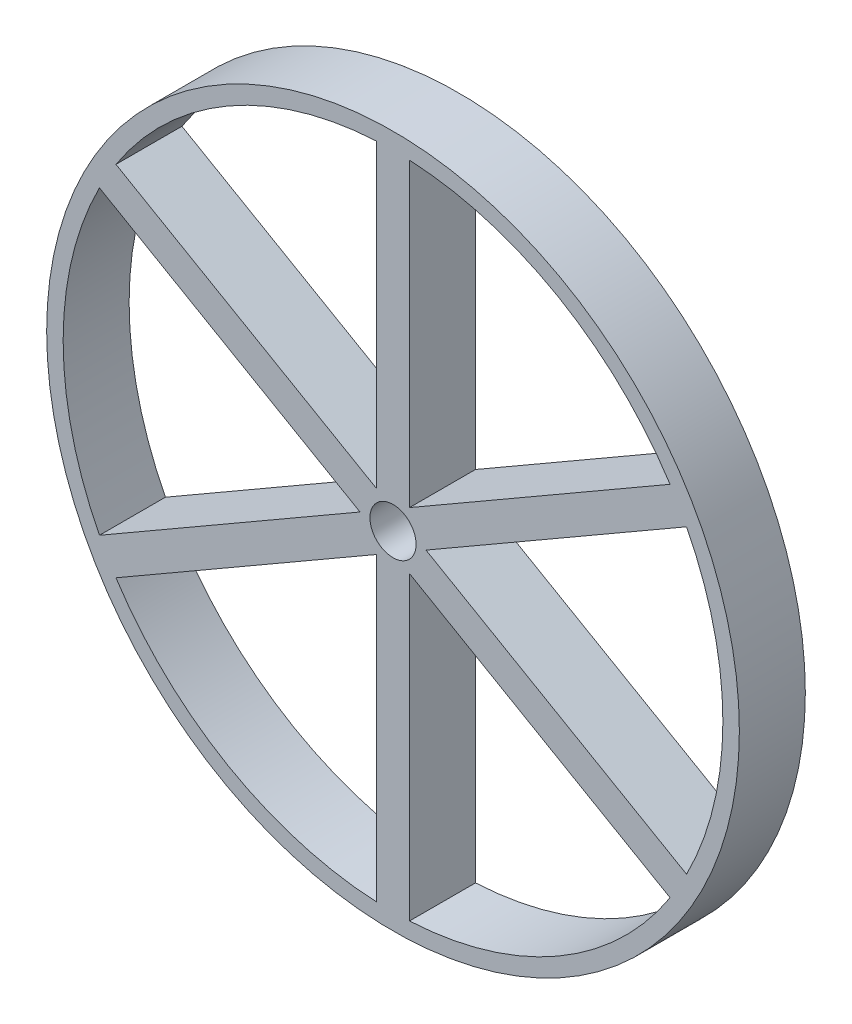
ISO-10303-21;
HEADER;
FILE_DESCRIPTION(('STEP AP214'),'2;1');
FILE_NAME('part.step','',(''),(''),'','','');
FILE_SCHEMA(('AUTOMOTIVE_DESIGN { 1 0 10303 214 1 1 1 1 }'));
ENDSEC;
DATA;
#1=APPLICATION_CONTEXT('core data for automotive mechanical design processes');
#2=APPLICATION_PROTOCOL_DEFINITION('international standard','automotive_design',2000,#1);
#3=PRODUCT_CONTEXT('',#1,'mechanical');
#4=PRODUCT('Part','Part','',(#3));
#5=PRODUCT_RELATED_PRODUCT_CATEGORY('part','',(#4));
#6=PRODUCT_DEFINITION_FORMATION('','',#4);
#7=PRODUCT_DEFINITION_CONTEXT('part definition',#1,'design');
#8=PRODUCT_DEFINITION('design','',#6,#7);
#9=PRODUCT_DEFINITION_SHAPE('','',#8);
#10=(LENGTH_UNIT() NAMED_UNIT(*) SI_UNIT(.MILLI.,.METRE.));
#11=(NAMED_UNIT(*) PLANE_ANGLE_UNIT() SI_UNIT($,.RADIAN.));
#12=(NAMED_UNIT(*) SI_UNIT($,.STERADIAN.) SOLID_ANGLE_UNIT());
#13=UNCERTAINTY_MEASURE_WITH_UNIT(LENGTH_MEASURE(1.E-05),#10,'distance_accuracy_value','');
#14=(GEOMETRIC_REPRESENTATION_CONTEXT(3) GLOBAL_UNCERTAINTY_ASSIGNED_CONTEXT((#13)) GLOBAL_UNIT_ASSIGNED_CONTEXT((#10,
#11,#12)) REPRESENTATION_CONTEXT('',''));
#15=CARTESIAN_POINT('',(0.,0.,0.));
#16=DIRECTION('',(0.,0.,1.));
#17=DIRECTION('',(1.,0.,0.));
#18=AXIS2_PLACEMENT_3D('',#15,#16,#17);
#19=CARTESIAN_POINT('',(2.5,0.,10.));
#20=DIRECTION('',(1.,0.,0.));
#21=DIRECTION('',(0.,1.,0.));
#22=AXIS2_PLACEMENT_3D('',#19,#20,#21);
#23=PLANE('',#22);
#24=DIRECTION('',(0.,-1.,0.));
#25=VECTOR('',#24,1.);
#26=CARTESIAN_POINT('',(2.5,0.,0.));
#27=LINE('',#26,#25);
#28=CARTESIAN_POINT('',(2.5,-4.33012701892219,0.));
#29=VERTEX_POINT('',#28);
#30=CARTESIAN_POINT('',(2.5,-49.9374608885955,0.));
#31=VERTEX_POINT('',#30);
#32=EDGE_CURVE('E171',#29,#31,#27,.T.);
#33=ORIENTED_EDGE('',*,*,#32,.F.);
#34=DIRECTION('',(0.,0.,-1.));
#35=VECTOR('',#34,1.);
#36=CARTESIAN_POINT('',(2.5,-4.33012701892219,10.));
#37=LINE('',#36,#35);
#38=CARTESIAN_POINT('',(2.5,-4.33012701892219,10.));
#39=VERTEX_POINT('',#38);
#40=EDGE_CURVE('E11',#39,#29,#37,.T.);
#41=ORIENTED_EDGE('',*,*,#40,.F.);
#42=DIRECTION('',(0.,-1.,0.));
#43=VECTOR('',#42,1.);
#44=CARTESIAN_POINT('',(2.5,0.,10.));
#45=LINE('',#44,#43);
#46=CARTESIAN_POINT('',(2.5,-49.9374608885955,10.));
#47=VERTEX_POINT('',#46);
#48=EDGE_CURVE('E169',#39,#47,#45,.T.);
#49=ORIENTED_EDGE('',*,*,#48,.T.);
#50=DIRECTION('',(0.,0.,-1.));
#51=VECTOR('',#50,1.);
#52=CARTESIAN_POINT('',(2.5,-49.9374608885955,10.));
#53=LINE('',#52,#51);
#54=EDGE_CURVE('E57',#47,#31,#53,.T.);
#55=ORIENTED_EDGE('',*,*,#54,.T.);
#56=EDGE_LOOP('',(#33,#41,#49,#55));
#57=FACE_BOUND('',#56,.T.);
#58=ADVANCED_FACE('F38',(#57),#23,.T.);
#59=CARTESIAN_POINT('',(-1.25,-2.1650635094611,10.));
#60=DIRECTION('',(0.5,0.866025403784439,0.));
#61=DIRECTION('',(-0.866025403784439,0.5,0.));
#62=AXIS2_PLACEMENT_3D('',#59,#60,#61);
#63=PLANE('',#62);
#64=DIRECTION('',(0.866025403784439,-0.5,0.));
#65=VECTOR('',#64,1.);
#66=CARTESIAN_POINT('',(-1.25,-2.1650635094611,0.));
#67=LINE('',#66,#65);
#68=CARTESIAN_POINT('',(41.9971097300155,-27.1337939537588,0.));
#69=VERTEX_POINT('',#68);
#70=EDGE_CURVE('E234',#29,#69,#67,.T.);
#71=ORIENTED_EDGE('',*,*,#70,.T.);
#72=DIRECTION('',(0.,0.,-1.));
#73=VECTOR('',#72,1.);
#74=CARTESIAN_POINT('',(41.9971097300155,-27.1337939537588,10.));
#75=LINE('',#74,#73);
#76=CARTESIAN_POINT('',(41.9971097300155,-27.1337939537588,10.));
#77=VERTEX_POINT('',#76);
#78=EDGE_CURVE('E48',#77,#69,#75,.T.);
#79=ORIENTED_EDGE('',*,*,#78,.F.);
#80=DIRECTION('',(0.866025403784439,-0.5,0.));
#81=VECTOR('',#80,1.);
#82=CARTESIAN_POINT('',(-1.25,-2.1650635094611,10.));
#83=LINE('',#82,#81);
#84=EDGE_CURVE('E174',#39,#77,#83,.T.);
#85=ORIENTED_EDGE('',*,*,#84,.F.);
#86=ORIENTED_EDGE('',*,*,#40,.T.);
#87=EDGE_LOOP('',(#71,#79,#85,#86));
#88=FACE_BOUND('',#87,.T.);
#89=ADVANCED_FACE('F175',(#88),#63,.F.);
#90=CARTESIAN_POINT('',(1.25,-2.1650635094611,10.));
#91=DIRECTION('',(0.5,-0.866025403784438,0.));
#92=DIRECTION('',(0.866025403784438,0.5,0.));
#93=AXIS2_PLACEMENT_3D('',#90,#91,#92);
#94=PLANE('',#93);
#95=DIRECTION('',(-0.866025403784438,-0.5,0.));
#96=VECTOR('',#95,1.);
#97=CARTESIAN_POINT('',(1.25,-2.1650635094611,0.));
#98=LINE('',#97,#96);
#99=CARTESIAN_POINT('',(-2.5,-4.33012701892219,0.));
#100=VERTEX_POINT('',#99);
#101=CARTESIAN_POINT('',(-41.9971097300155,-27.1337939537588,0.));
#102=VERTEX_POINT('',#101);
#103=EDGE_CURVE('E226',#100,#102,#98,.T.);
#104=ORIENTED_EDGE('',*,*,#103,.F.);
#105=DIRECTION('',(0.,0.,-1.));
#106=VECTOR('',#105,1.);
#107=CARTESIAN_POINT('',(-2.5,-4.33012701892219,10.));
#108=LINE('',#107,#106);
#109=CARTESIAN_POINT('',(-2.5,-4.33012701892219,10.));
#110=VERTEX_POINT('',#109);
#111=EDGE_CURVE('E241',#110,#100,#108,.T.);
#112=ORIENTED_EDGE('',*,*,#111,.F.);
#113=DIRECTION('',(-0.866025403784438,-0.5,0.));
#114=VECTOR('',#113,1.);
#115=CARTESIAN_POINT('',(1.25,-2.1650635094611,10.));
#116=LINE('',#115,#114);
#117=CARTESIAN_POINT('',(-41.9971097300155,-27.1337939537588,10.));
#118=VERTEX_POINT('',#117);
#119=EDGE_CURVE('E307',#110,#118,#116,.T.);
#120=ORIENTED_EDGE('',*,*,#119,.T.);
#121=DIRECTION('',(0.,0.,-1.));
#122=VECTOR('',#121,1.);
#123=CARTESIAN_POINT('',(-41.9971097300155,-27.1337939537588,10.));
#124=LINE('',#123,#122);
#125=EDGE_CURVE('E243',#118,#102,#124,.T.);
#126=ORIENTED_EDGE('',*,*,#125,.T.);
#127=EDGE_LOOP('',(#104,#112,#120,#126));
#128=FACE_BOUND('',#127,.T.);
#129=ADVANCED_FACE('F352',(#128),#94,.T.);
#130=CARTESIAN_POINT('',(-2.5,0.,10.));
#131=DIRECTION('',(1.,0.,0.));
#132=DIRECTION('',(0.,1.,0.));
#133=AXIS2_PLACEMENT_3D('',#130,#131,#132);
#134=PLANE('',#133);
#135=DIRECTION('',(0.,-1.,0.));
#136=VECTOR('',#135,1.);
#137=CARTESIAN_POINT('',(-2.5,0.,0.));
#138=LINE('',#137,#136);
#139=CARTESIAN_POINT('',(-2.5,-49.9374608885955,0.));
#140=VERTEX_POINT('',#139);
#141=EDGE_CURVE('E229',#100,#140,#138,.T.);
#142=ORIENTED_EDGE('',*,*,#141,.T.);
#143=DIRECTION('',(0.,0.,-1.));
#144=VECTOR('',#143,1.);
#145=CARTESIAN_POINT('',(-2.5,-49.9374608885955,10.));
#146=LINE('',#145,#144);
#147=CARTESIAN_POINT('',(-2.5,-49.9374608885955,10.));
#148=VERTEX_POINT('',#147);
#149=EDGE_CURVE('E245',#148,#140,#146,.T.);
#150=ORIENTED_EDGE('',*,*,#149,.F.);
#151=DIRECTION('',(0.,-1.,0.));
#152=VECTOR('',#151,1.);
#153=CARTESIAN_POINT('',(-2.5,0.,10.));
#154=LINE('',#153,#152);
#155=EDGE_CURVE('E184',#110,#148,#154,.T.);
#156=ORIENTED_EDGE('',*,*,#155,.F.);
#157=ORIENTED_EDGE('',*,*,#111,.T.);
#158=EDGE_LOOP('',(#142,#150,#156,#157));
#159=FACE_BOUND('',#158,.T.);
#160=ADVANCED_FACE('F354',(#159),#134,.F.);
#161=CARTESIAN_POINT('',(-1.25,-2.1650635094611,10.));
#162=DIRECTION('',(-0.499999999999999,-0.866025403784439,0.));
#163=DIRECTION('',(0.866025403784439,-0.499999999999999,0.));
#164=AXIS2_PLACEMENT_3D('',#161,#162,#163);
#165=PLANE('',#164);
#166=DIRECTION('',(-0.866025403784439,0.499999999999999,0.));
#167=VECTOR('',#166,1.);
#168=CARTESIAN_POINT('',(-1.25,-2.1650635094611,0.));
#169=LINE('',#168,#167);
#170=CARTESIAN_POINT('',(-5.,0.,0.));
#171=VERTEX_POINT('',#170);
#172=CARTESIAN_POINT('',(-44.4971097300155,22.8036669348366,0.));
#173=VERTEX_POINT('',#172);
#174=EDGE_CURVE('E219',#171,#173,#169,.T.);
#175=ORIENTED_EDGE('',*,*,#174,.F.);
#176=DIRECTION('',(0.,0.,-1.));
#177=VECTOR('',#176,1.);
#178=CARTESIAN_POINT('',(-5.,0.,10.));
#179=LINE('',#178,#177);
#180=CARTESIAN_POINT('',(-5.,0.,10.));
#181=VERTEX_POINT('',#180);
#182=EDGE_CURVE('E246',#181,#171,#179,.T.);
#183=ORIENTED_EDGE('',*,*,#182,.F.);
#184=DIRECTION('',(-0.866025403784439,0.499999999999999,0.));
#185=VECTOR('',#184,1.);
#186=CARTESIAN_POINT('',(-1.25,-2.1650635094611,10.));
#187=LINE('',#186,#185);
#188=CARTESIAN_POINT('',(-44.4971097300155,22.8036669348366,10.));
#189=VERTEX_POINT('',#188);
#190=EDGE_CURVE('E299',#181,#189,#187,.T.);
#191=ORIENTED_EDGE('',*,*,#190,.T.);
#192=DIRECTION('',(0.,0.,-1.));
#193=VECTOR('',#192,1.);
#194=CARTESIAN_POINT('',(-44.4971097300155,22.8036669348366,10.));
#195=LINE('',#194,#193);
#196=EDGE_CURVE('E249',#189,#173,#195,.T.);
#197=ORIENTED_EDGE('',*,*,#196,.T.);
#198=EDGE_LOOP('',(#175,#183,#191,#197));
#199=FACE_BOUND('',#198,.T.);
#200=ADVANCED_FACE('F357',(#199),#165,.T.);
#201=CARTESIAN_POINT('',(-1.25,2.1650635094611,10.));
#202=DIRECTION('',(0.5,-0.866025403784438,0.));
#203=DIRECTION('',(0.866025403784438,0.5,0.));
#204=AXIS2_PLACEMENT_3D('',#201,#202,#203);
#205=PLANE('',#204);
#206=DIRECTION('',(-0.866025403784439,-0.5,0.));
#207=VECTOR('',#206,1.);
#208=CARTESIAN_POINT('',(-1.25,2.1650635094611,0.));
#209=LINE('',#208,#207);
#210=CARTESIAN_POINT('',(-44.4971097300155,-22.8036669348366,0.));
#211=VERTEX_POINT('',#210);
#212=EDGE_CURVE('E222',#171,#211,#209,.T.);
#213=ORIENTED_EDGE('',*,*,#212,.T.);
#214=DIRECTION('',(0.,0.,-1.));
#215=VECTOR('',#214,1.);
#216=CARTESIAN_POINT('',(-44.4971097300155,-22.8036669348366,10.));
#217=LINE('',#216,#215);
#218=CARTESIAN_POINT('',(-44.4971097300155,-22.8036669348366,10.));
#219=VERTEX_POINT('',#218);
#220=EDGE_CURVE('E251',#219,#211,#217,.T.);
#221=ORIENTED_EDGE('',*,*,#220,.F.);
#222=DIRECTION('',(-0.866025403784439,-0.5,0.));
#223=VECTOR('',#222,1.);
#224=CARTESIAN_POINT('',(-1.25,2.1650635094611,10.));
#225=LINE('',#224,#223);
#226=EDGE_CURVE('E303',#181,#219,#225,.T.);
#227=ORIENTED_EDGE('',*,*,#226,.F.);
#228=ORIENTED_EDGE('',*,*,#182,.T.);
#229=EDGE_LOOP('',(#213,#221,#227,#228));
#230=FACE_BOUND('',#229,.T.);
#231=ADVANCED_FACE('F318',(#230),#205,.F.);
#232=CARTESIAN_POINT('',(-2.5,0.,10.));
#233=DIRECTION('',(-1.,0.,0.));
#234=DIRECTION('',(0.,0.,1.));
#235=AXIS2_PLACEMENT_3D('',#232,#233,#234);
#236=PLANE('',#235);
#237=DIRECTION('',(0.,1.,0.));
#238=VECTOR('',#237,1.);
#239=CARTESIAN_POINT('',(-2.5,0.,0.));
#240=LINE('',#239,#238);
#241=CARTESIAN_POINT('',(-2.5,4.33012701892219,0.));
#242=VERTEX_POINT('',#241);
#243=CARTESIAN_POINT('',(-2.5,49.9374608885955,0.));
#244=VERTEX_POINT('',#243);
#245=EDGE_CURVE('E212',#242,#244,#240,.T.);
#246=ORIENTED_EDGE('',*,*,#245,.F.);
#247=DIRECTION('',(0.,0.,-1.));
#248=VECTOR('',#247,1.);
#249=CARTESIAN_POINT('',(-2.5,4.33012701892219,10.));
#250=LINE('',#249,#248);
#251=CARTESIAN_POINT('',(-2.5,4.33012701892219,10.));
#252=VERTEX_POINT('',#251);
#253=EDGE_CURVE('E252',#252,#242,#250,.T.);
#254=ORIENTED_EDGE('',*,*,#253,.F.);
#255=DIRECTION('',(0.,1.,0.));
#256=VECTOR('',#255,1.);
#257=CARTESIAN_POINT('',(-2.5,0.,10.));
#258=LINE('',#257,#256);
#259=CARTESIAN_POINT('',(-2.5,49.9374608885955,10.));
#260=VERTEX_POINT('',#259);
#261=EDGE_CURVE('E290',#252,#260,#258,.T.);
#262=ORIENTED_EDGE('',*,*,#261,.T.);
#263=DIRECTION('',(0.,0.,-1.));
#264=VECTOR('',#263,1.);
#265=CARTESIAN_POINT('',(-2.5,49.9374608885955,10.));
#266=LINE('',#265,#264);
#267=EDGE_CURVE('E255',#260,#244,#266,.T.);
#268=ORIENTED_EDGE('',*,*,#267,.T.);
#269=EDGE_LOOP('',(#246,#254,#262,#268));
#270=FACE_BOUND('',#269,.T.);
#271=ADVANCED_FACE('F364',(#270),#236,.T.);
#272=CARTESIAN_POINT('',(1.25,2.1650635094611,10.));
#273=DIRECTION('',(-0.499999999999999,-0.866025403784439,0.));
#274=DIRECTION('',(0.866025403784439,-0.499999999999999,0.));
#275=AXIS2_PLACEMENT_3D('',#272,#273,#274);
#276=PLANE('',#275);
#277=DIRECTION('',(-0.866025403784439,0.499999999999999,0.));
#278=VECTOR('',#277,1.);
#279=CARTESIAN_POINT('',(1.25,2.1650635094611,0.));
#280=LINE('',#279,#278);
#281=CARTESIAN_POINT('',(-41.9971097300155,27.1337939537588,0.));
#282=VERTEX_POINT('',#281);
#283=EDGE_CURVE('E215',#242,#282,#280,.T.);
#284=ORIENTED_EDGE('',*,*,#283,.T.);
#285=DIRECTION('',(0.,0.,-1.));
#286=VECTOR('',#285,1.);
#287=CARTESIAN_POINT('',(-41.9971097300155,27.1337939537588,10.));
#288=LINE('',#287,#286);
#289=CARTESIAN_POINT('',(-41.9971097300155,27.1337939537588,10.));
#290=VERTEX_POINT('',#289);
#291=EDGE_CURVE('E257',#290,#282,#288,.T.);
#292=ORIENTED_EDGE('',*,*,#291,.F.);
#293=DIRECTION('',(-0.866025403784439,0.499999999999999,0.));
#294=VECTOR('',#293,1.);
#295=CARTESIAN_POINT('',(1.25,2.1650635094611,10.));
#296=LINE('',#295,#294);
#297=EDGE_CURVE('E295',#252,#290,#296,.T.);
#298=ORIENTED_EDGE('',*,*,#297,.F.);
#299=ORIENTED_EDGE('',*,*,#253,.T.);
#300=EDGE_LOOP('',(#284,#292,#298,#299));
#301=FACE_BOUND('',#300,.T.);
#302=ADVANCED_FACE('F368',(#301),#276,.F.);
#303=CARTESIAN_POINT('',(-1.25,2.16506350946109,10.));
#304=DIRECTION('',(-0.5,0.866025403784438,0.));
#305=DIRECTION('',(-0.866025403784439,-0.5,0.));
#306=AXIS2_PLACEMENT_3D('',#303,#304,#305);
#307=PLANE('',#306);
#308=DIRECTION('',(0.866025403784439,0.5,0.));
#309=VECTOR('',#308,1.);
#310=CARTESIAN_POINT('',(-1.25,2.16506350946109,0.));
#311=LINE('',#310,#309);
#312=CARTESIAN_POINT('',(2.5,4.33012701892219,0.));
#313=VERTEX_POINT('',#312);
#314=CARTESIAN_POINT('',(41.9971097300155,27.1337939537588,0.));
#315=VERTEX_POINT('',#314);
#316=EDGE_CURVE('E204',#313,#315,#311,.T.);
#317=ORIENTED_EDGE('',*,*,#316,.F.);
#318=DIRECTION('',(0.,0.,-1.));
#319=VECTOR('',#318,1.);
#320=CARTESIAN_POINT('',(2.5,4.33012701892219,10.));
#321=LINE('',#320,#319);
#322=CARTESIAN_POINT('',(2.5,4.33012701892219,10.));
#323=VERTEX_POINT('',#322);
#324=EDGE_CURVE('E258',#323,#313,#321,.T.);
#325=ORIENTED_EDGE('',*,*,#324,.F.);
#326=DIRECTION('',(0.866025403784439,0.5,0.));
#327=VECTOR('',#326,1.);
#328=CARTESIAN_POINT('',(-1.25,2.16506350946109,10.));
#329=LINE('',#328,#327);
#330=CARTESIAN_POINT('',(41.9971097300155,27.1337939537588,10.));
#331=VERTEX_POINT('',#330);
#332=EDGE_CURVE('E283',#323,#331,#329,.T.);
#333=ORIENTED_EDGE('',*,*,#332,.T.);
#334=DIRECTION('',(0.,0.,-1.));
#335=VECTOR('',#334,1.);
#336=CARTESIAN_POINT('',(41.9971097300155,27.1337939537588,10.));
#337=LINE('',#336,#335);
#338=EDGE_CURVE('E261',#331,#315,#337,.T.);
#339=ORIENTED_EDGE('',*,*,#338,.T.);
#340=EDGE_LOOP('',(#317,#325,#333,#339));
#341=FACE_BOUND('',#340,.T.);
#342=ADVANCED_FACE('F371',(#341),#307,.T.);
#343=CARTESIAN_POINT('',(2.5,0.,10.));
#344=DIRECTION('',(-1.,0.,0.));
#345=DIRECTION('',(0.,0.,1.));
#346=AXIS2_PLACEMENT_3D('',#343,#344,#345);
#347=PLANE('',#346);
#348=DIRECTION('',(0.,1.,0.));
#349=VECTOR('',#348,1.);
#350=CARTESIAN_POINT('',(2.5,0.,0.));
#351=LINE('',#350,#349);
#352=CARTESIAN_POINT('',(2.5,49.9374608885955,0.));
#353=VERTEX_POINT('',#352);
#354=EDGE_CURVE('E209',#313,#353,#351,.T.);
#355=ORIENTED_EDGE('',*,*,#354,.T.);
#356=DIRECTION('',(0.,0.,-1.));
#357=VECTOR('',#356,1.);
#358=CARTESIAN_POINT('',(2.5,49.9374608885955,10.));
#359=LINE('',#358,#357);
#360=CARTESIAN_POINT('',(2.5,49.9374608885955,10.));
#361=VERTEX_POINT('',#360);
#362=EDGE_CURVE('E263',#361,#353,#359,.T.);
#363=ORIENTED_EDGE('',*,*,#362,.F.);
#364=DIRECTION('',(0.,1.,0.));
#365=VECTOR('',#364,1.);
#366=CARTESIAN_POINT('',(2.5,0.,10.));
#367=LINE('',#366,#365);
#368=EDGE_CURVE('E286',#323,#361,#367,.T.);
#369=ORIENTED_EDGE('',*,*,#368,.F.);
#370=ORIENTED_EDGE('',*,*,#324,.T.);
#371=EDGE_LOOP('',(#355,#363,#369,#370));
#372=FACE_BOUND('',#371,.T.);
#373=ADVANCED_FACE('F376',(#372),#347,.F.);
#374=CARTESIAN_POINT('',(1.25,2.1650635094611,10.));
#375=DIRECTION('',(0.5,0.866025403784439,0.));
#376=DIRECTION('',(-0.866025403784439,0.5,0.));
#377=AXIS2_PLACEMENT_3D('',#374,#375,#376);
#378=PLANE('',#377);
#379=DIRECTION('',(0.866025403784439,-0.5,0.));
#380=VECTOR('',#379,1.);
#381=CARTESIAN_POINT('',(1.25,2.1650635094611,0.));
#382=LINE('',#381,#380);
#383=CARTESIAN_POINT('',(5.,0.,0.));
#384=VERTEX_POINT('',#383);
#385=CARTESIAN_POINT('',(44.4971097300155,-22.8036669348366,0.));
#386=VERTEX_POINT('',#385);
#387=EDGE_CURVE('E194',#384,#386,#382,.T.);
#388=ORIENTED_EDGE('',*,*,#387,.F.);
#389=DIRECTION('',(0.,0.,-1.));
#390=VECTOR('',#389,1.);
#391=CARTESIAN_POINT('',(5.,0.,10.));
#392=LINE('',#391,#390);
#393=CARTESIAN_POINT('',(5.,0.,10.));
#394=VERTEX_POINT('',#393);
#395=EDGE_CURVE('E42',#394,#384,#392,.T.);
#396=ORIENTED_EDGE('',*,*,#395,.F.);
#397=DIRECTION('',(0.866025403784439,-0.5,0.));
#398=VECTOR('',#397,1.);
#399=CARTESIAN_POINT('',(1.25,2.1650635094611,10.));
#400=LINE('',#399,#398);
#401=CARTESIAN_POINT('',(44.4971097300155,-22.8036669348366,10.));
#402=VERTEX_POINT('',#401);
#403=EDGE_CURVE('E239',#394,#402,#400,.T.);
#404=ORIENTED_EDGE('',*,*,#403,.T.);
#405=DIRECTION('',(0.,0.,-1.));
#406=VECTOR('',#405,1.);
#407=CARTESIAN_POINT('',(44.4971097300155,-22.8036669348366,10.));
#408=LINE('',#407,#406);
#409=EDGE_CURVE('E193',#402,#386,#408,.T.);
#410=ORIENTED_EDGE('',*,*,#409,.T.);
#411=EDGE_LOOP('',(#388,#396,#404,#410));
#412=FACE_BOUND('',#411,.T.);
#413=ADVANCED_FACE('F40',(#412),#378,.T.);
#414=CARTESIAN_POINT('',(1.25,-2.1650635094611,10.));
#415=DIRECTION('',(-0.5,0.866025403784438,0.));
#416=DIRECTION('',(-0.866025403784439,-0.5,0.));
#417=AXIS2_PLACEMENT_3D('',#414,#415,#416);
#418=PLANE('',#417);
#419=DIRECTION('',(0.866025403784439,0.5,0.));
#420=VECTOR('',#419,1.);
#421=CARTESIAN_POINT('',(1.25,-2.1650635094611,0.));
#422=LINE('',#421,#420);
#423=CARTESIAN_POINT('',(44.4971097300155,22.8036669348366,0.));
#424=VERTEX_POINT('',#423);
#425=EDGE_CURVE('E197',#384,#424,#422,.T.);
#426=ORIENTED_EDGE('',*,*,#425,.T.);
#427=DIRECTION('',(0.,0.,-1.));
#428=VECTOR('',#427,1.);
#429=CARTESIAN_POINT('',(44.4971097300155,22.8036669348366,10.));
#430=LINE('',#429,#428);
#431=CARTESIAN_POINT('',(44.4971097300155,22.8036669348366,10.));
#432=VERTEX_POINT('',#431);
#433=EDGE_CURVE('E266',#432,#424,#430,.T.);
#434=ORIENTED_EDGE('',*,*,#433,.F.);
#435=DIRECTION('',(0.866025403784439,0.5,0.));
#436=VECTOR('',#435,1.);
#437=CARTESIAN_POINT('',(1.25,-2.1650635094611,10.));
#438=LINE('',#437,#436);
#439=EDGE_CURVE('E274',#394,#432,#438,.T.);
#440=ORIENTED_EDGE('',*,*,#439,.F.);
#441=ORIENTED_EDGE('',*,*,#395,.T.);
#442=EDGE_LOOP('',(#426,#434,#440,#441));
#443=FACE_BOUND('',#442,.T.);
#444=ADVANCED_FACE('F273',(#443),#418,.F.);
#445=CARTESIAN_POINT('',(0.,0.,10.));
#446=DIRECTION('',(0.,0.,-1.));
#447=DIRECTION('',(-1.,0.,0.));
#448=AXIS2_PLACEMENT_3D('',#445,#446,#447);
#449=CYLINDRICAL_SURFACE('',#448,52.5);
#450=CARTESIAN_POINT('',(0.,0.,10.));
#451=DIRECTION('',(0.,0.,1.));
#452=DIRECTION('',(1.,0.,0.));
#453=AXIS2_PLACEMENT_3D('',#450,#451,#452);
#454=CIRCLE('',#453,52.5);
#455=CARTESIAN_POINT('',(52.5,0.,10.));
#456=VERTEX_POINT('',#455);
#457=EDGE_CURVE('E190',#456,#456,#454,.T.);
#458=ORIENTED_EDGE('',*,*,#457,.F.);
#459=EDGE_LOOP('',(#458));
#460=FACE_BOUND('',#459,.T.);
#461=CARTESIAN_POINT('',(0.,0.,0.));
#462=DIRECTION('',(0.,0.,1.));
#463=DIRECTION('',(1.,0.,0.));
#464=AXIS2_PLACEMENT_3D('',#461,#462,#463);
#465=CIRCLE('',#464,52.5);
#466=CARTESIAN_POINT('',(52.5,0.,0.));
#467=VERTEX_POINT('',#466);
#468=EDGE_CURVE('E236',#467,#467,#465,.T.);
#469=ORIENTED_EDGE('',*,*,#468,.T.);
#470=EDGE_LOOP('',(#469));
#471=FACE_BOUND('',#470,.T.);
#472=ADVANCED_FACE('F335',(#460,#471),#449,.T.);
#473=CARTESIAN_POINT('',(0.,0.,10.));
#474=DIRECTION('',(0.,0.,-1.));
#475=DIRECTION('',(-1.,0.,0.));
#476=AXIS2_PLACEMENT_3D('',#473,#474,#475);
#477=CYLINDRICAL_SURFACE('',#476,50.);
#478=CARTESIAN_POINT('',(0.,0.,0.));
#479=DIRECTION('',(0.,0.,1.));
#480=DIRECTION('',(1.,0.,0.));
#481=AXIS2_PLACEMENT_3D('',#478,#479,#480);
#482=CIRCLE('',#481,50.);
#483=EDGE_CURVE('E205',#31,#69,#482,.T.);
#484=ORIENTED_EDGE('',*,*,#483,.F.);
#485=ORIENTED_EDGE('',*,*,#54,.F.);
#486=CARTESIAN_POINT('',(0.,0.,10.));
#487=DIRECTION('',(0.,0.,1.));
#488=DIRECTION('',(1.,0.,0.));
#489=AXIS2_PLACEMENT_3D('',#486,#487,#488);
#490=CIRCLE('',#489,50.);
#491=EDGE_CURVE('E177',#47,#77,#490,.T.);
#492=ORIENTED_EDGE('',*,*,#491,.T.);
#493=ORIENTED_EDGE('',*,*,#78,.T.);
#494=EDGE_LOOP('',(#484,#485,#492,#493));
#495=FACE_BOUND('',#494,.T.);
#496=ADVANCED_FACE('F332',(#495),#477,.F.);
#497=EDGE_CURVE('E232',#102,#140,#482,.T.);
#498=ORIENTED_EDGE('',*,*,#497,.F.);
#499=ORIENTED_EDGE('',*,*,#125,.F.);
#500=EDGE_CURVE('E181',#118,#148,#490,.T.);
#501=ORIENTED_EDGE('',*,*,#500,.T.);
#502=ORIENTED_EDGE('',*,*,#149,.T.);
#503=EDGE_LOOP('',(#498,#499,#501,#502));
#504=FACE_BOUND('',#503,.T.);
#505=ADVANCED_FACE('F334',(#504),#477,.F.);
#506=EDGE_CURVE('E225',#173,#211,#482,.T.);
#507=ORIENTED_EDGE('',*,*,#506,.F.);
#508=ORIENTED_EDGE('',*,*,#196,.F.);
#509=EDGE_CURVE('E186',#189,#219,#490,.T.);
#510=ORIENTED_EDGE('',*,*,#509,.T.);
#511=ORIENTED_EDGE('',*,*,#220,.T.);
#512=EDGE_LOOP('',(#507,#508,#510,#511));
#513=FACE_BOUND('',#512,.T.);
#514=ADVANCED_FACE('F322',(#513),#477,.F.);
#515=EDGE_CURVE('E218',#244,#282,#482,.T.);
#516=ORIENTED_EDGE('',*,*,#515,.F.);
#517=ORIENTED_EDGE('',*,*,#267,.F.);
#518=EDGE_CURVE('E291',#260,#290,#490,.T.);
#519=ORIENTED_EDGE('',*,*,#518,.T.);
#520=ORIENTED_EDGE('',*,*,#291,.T.);
#521=EDGE_LOOP('',(#516,#517,#519,#520));
#522=FACE_BOUND('',#521,.T.);
#523=ADVANCED_FACE('F474',(#522),#477,.F.);
#524=EDGE_CURVE('E206',#315,#353,#482,.T.);
#525=ORIENTED_EDGE('',*,*,#524,.F.);
#526=ORIENTED_EDGE('',*,*,#338,.F.);
#527=EDGE_CURVE('E284',#331,#361,#490,.T.);
#528=ORIENTED_EDGE('',*,*,#527,.T.);
#529=ORIENTED_EDGE('',*,*,#362,.T.);
#530=EDGE_LOOP('',(#525,#526,#528,#529));
#531=FACE_BOUND('',#530,.T.);
#532=ADVANCED_FACE('F346',(#531),#477,.F.);
#533=EDGE_CURVE('E201',#386,#424,#482,.T.);
#534=ORIENTED_EDGE('',*,*,#533,.F.);
#535=ORIENTED_EDGE('',*,*,#409,.F.);
#536=EDGE_CURVE('E281',#402,#432,#490,.T.);
#537=ORIENTED_EDGE('',*,*,#536,.T.);
#538=ORIENTED_EDGE('',*,*,#433,.T.);
#539=EDGE_LOOP('',(#534,#535,#537,#538));
#540=FACE_BOUND('',#539,.T.);
#541=ADVANCED_FACE('F280',(#540),#477,.F.);
#542=CARTESIAN_POINT('',(0.,0.,10.));
#543=DIRECTION('',(0.,0.,1.));
#544=DIRECTION('',(1.,0.,0.));
#545=AXIS2_PLACEMENT_3D('',#542,#543,#544);
#546=PLANE('',#545);
#547=CARTESIAN_POINT('',(0.,0.,10.));
#548=DIRECTION('',(0.,0.,1.));
#549=DIRECTION('',(1.,0.,0.));
#550=AXIS2_PLACEMENT_3D('',#547,#548,#549);
#551=CIRCLE('',#550,3.5);
#552=CARTESIAN_POINT('',(3.5,0.,10.));
#553=VERTEX_POINT('',#552);
#554=EDGE_CURVE('E198',#553,#553,#551,.T.);
#555=ORIENTED_EDGE('',*,*,#554,.F.);
#556=EDGE_LOOP('',(#555));
#557=FACE_BOUND('',#556,.T.);
#558=ORIENTED_EDGE('',*,*,#403,.F.);
#559=ORIENTED_EDGE('',*,*,#439,.T.);
#560=ORIENTED_EDGE('',*,*,#536,.F.);
#561=EDGE_LOOP('',(#558,#559,#560));
#562=FACE_BOUND('',#561,.T.);
#563=ORIENTED_EDGE('',*,*,#332,.F.);
#564=ORIENTED_EDGE('',*,*,#368,.T.);
#565=ORIENTED_EDGE('',*,*,#527,.F.);
#566=EDGE_LOOP('',(#563,#564,#565));
#567=FACE_BOUND('',#566,.T.);
#568=ORIENTED_EDGE('',*,*,#261,.F.);
#569=ORIENTED_EDGE('',*,*,#297,.T.);
#570=ORIENTED_EDGE('',*,*,#518,.F.);
#571=EDGE_LOOP('',(#568,#569,#570));
#572=FACE_BOUND('',#571,.T.);
#573=ORIENTED_EDGE('',*,*,#190,.F.);
#574=ORIENTED_EDGE('',*,*,#226,.T.);
#575=ORIENTED_EDGE('',*,*,#509,.F.);
#576=EDGE_LOOP('',(#573,#574,#575));
#577=FACE_BOUND('',#576,.T.);
#578=ORIENTED_EDGE('',*,*,#119,.F.);
#579=ORIENTED_EDGE('',*,*,#155,.T.);
#580=ORIENTED_EDGE('',*,*,#500,.F.);
#581=EDGE_LOOP('',(#578,#579,#580));
#582=FACE_BOUND('',#581,.T.);
#583=ORIENTED_EDGE('',*,*,#48,.F.);
#584=ORIENTED_EDGE('',*,*,#84,.T.);
#585=ORIENTED_EDGE('',*,*,#491,.F.);
#586=EDGE_LOOP('',(#583,#584,#585));
#587=FACE_BOUND('',#586,.T.);
#588=ORIENTED_EDGE('',*,*,#457,.T.);
#589=EDGE_LOOP('',(#588));
#590=FACE_BOUND('',#589,.T.);
#591=ADVANCED_FACE('F179',(#557,#562,#567,#572,#577,#582,#587,#590),#546,.T.);
#592=CARTESIAN_POINT('',(0.,0.,0.));
#593=DIRECTION('',(0.,0.,1.));
#594=DIRECTION('',(1.,0.,0.));
#595=AXIS2_PLACEMENT_3D('',#592,#593,#594);
#596=PLANE('',#595);
#597=CARTESIAN_POINT('',(0.,0.,0.));
#598=DIRECTION('',(0.,0.,1.));
#599=DIRECTION('',(1.,0.,0.));
#600=AXIS2_PLACEMENT_3D('',#597,#598,#599);
#601=CIRCLE('',#600,3.5);
#602=CARTESIAN_POINT('',(3.5,0.,0.));
#603=VERTEX_POINT('',#602);
#604=EDGE_CURVE('E572',#603,#603,#601,.T.);
#605=ORIENTED_EDGE('',*,*,#604,.T.);
#606=EDGE_LOOP('',(#605));
#607=FACE_BOUND('',#606,.T.);
#608=ORIENTED_EDGE('',*,*,#387,.T.);
#609=ORIENTED_EDGE('',*,*,#533,.T.);
#610=ORIENTED_EDGE('',*,*,#425,.F.);
#611=EDGE_LOOP('',(#608,#609,#610));
#612=FACE_BOUND('',#611,.T.);
#613=ORIENTED_EDGE('',*,*,#316,.T.);
#614=ORIENTED_EDGE('',*,*,#524,.T.);
#615=ORIENTED_EDGE('',*,*,#354,.F.);
#616=EDGE_LOOP('',(#613,#614,#615));
#617=FACE_BOUND('',#616,.T.);
#618=ORIENTED_EDGE('',*,*,#245,.T.);
#619=ORIENTED_EDGE('',*,*,#515,.T.);
#620=ORIENTED_EDGE('',*,*,#283,.F.);
#621=EDGE_LOOP('',(#618,#619,#620));
#622=FACE_BOUND('',#621,.T.);
#623=ORIENTED_EDGE('',*,*,#174,.T.);
#624=ORIENTED_EDGE('',*,*,#506,.T.);
#625=ORIENTED_EDGE('',*,*,#212,.F.);
#626=EDGE_LOOP('',(#623,#624,#625));
#627=FACE_BOUND('',#626,.T.);
#628=ORIENTED_EDGE('',*,*,#103,.T.);
#629=ORIENTED_EDGE('',*,*,#497,.T.);
#630=ORIENTED_EDGE('',*,*,#141,.F.);
#631=EDGE_LOOP('',(#628,#629,#630));
#632=FACE_BOUND('',#631,.T.);
#633=ORIENTED_EDGE('',*,*,#32,.T.);
#634=ORIENTED_EDGE('',*,*,#483,.T.);
#635=ORIENTED_EDGE('',*,*,#70,.F.);
#636=EDGE_LOOP('',(#633,#634,#635));
#637=FACE_BOUND('',#636,.T.);
#638=ORIENTED_EDGE('',*,*,#468,.F.);
#639=EDGE_LOOP('',(#638));
#640=FACE_BOUND('',#639,.T.);
#641=ADVANCED_FACE('F277',(#607,#612,#617,#622,#627,#632,#637,#640),#596,.F.);
#642=CARTESIAN_POINT('',(0.,0.,10.));
#643=DIRECTION('',(0.,0.,-1.));
#644=DIRECTION('',(-1.,0.,0.));
#645=AXIS2_PLACEMENT_3D('',#642,#643,#644);
#646=CYLINDRICAL_SURFACE('',#645,3.5);
#647=ORIENTED_EDGE('',*,*,#554,.T.);
#648=EDGE_LOOP('',(#647));
#649=FACE_BOUND('',#648,.T.);
#650=ORIENTED_EDGE('',*,*,#604,.F.);
#651=EDGE_LOOP('',(#650));
#652=FACE_BOUND('',#651,.T.);
#653=ADVANCED_FACE('F527',(#649,#652),#646,.F.);
#654=CLOSED_SHELL('',(#58,#89,#129,#160,#200,#231,#271,#302,#342,#373,#413,#444,#472,#496,#505,
#514,#523,#532,#541,#591,#641,#653));
#655=MANIFOLD_SOLID_BREP('B2',#654);
#656=ADVANCED_BREP_SHAPE_REPRESENTATION('',(#18,#655),#14);
#657=SHAPE_DEFINITION_REPRESENTATION(#9,#656);
ENDSEC;
END-ISO-10303-21;
